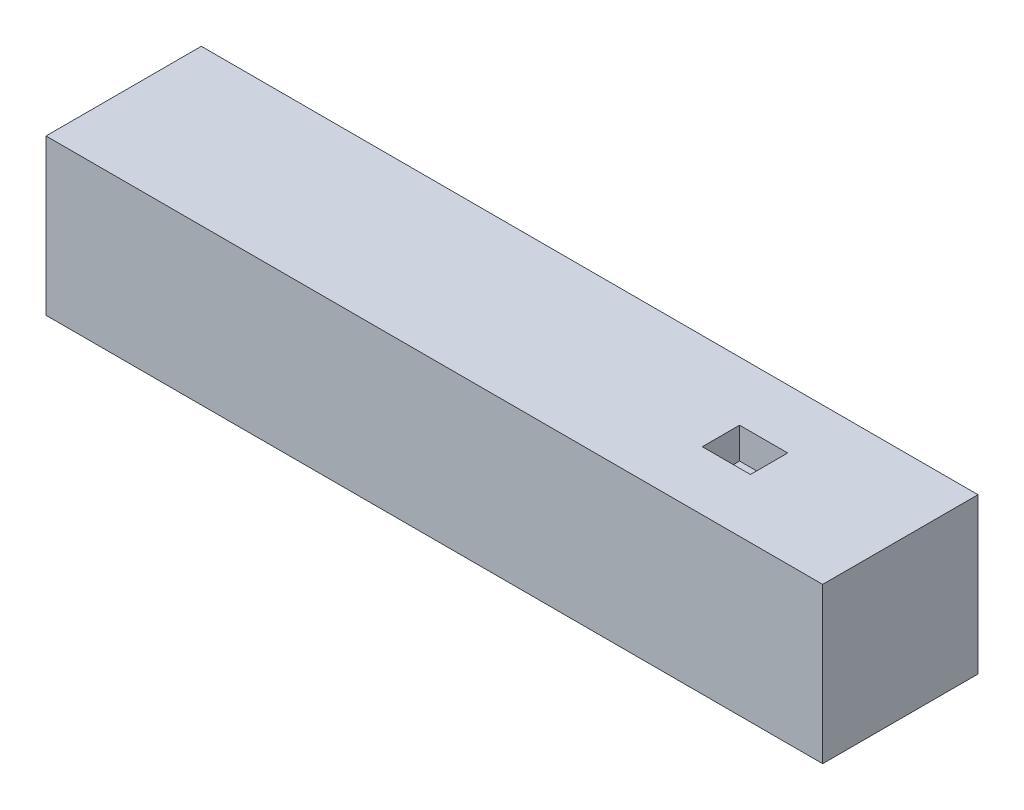
ISO-10303-21;
HEADER;
FILE_DESCRIPTION(('STEP AP214'),'2;1');
FILE_NAME('part.step','',(''),(''),'','','');
FILE_SCHEMA(('AUTOMOTIVE_DESIGN { 1 0 10303 214 1 1 1 1 }'));
ENDSEC;
DATA;
#1=APPLICATION_CONTEXT('core data for automotive mechanical design processes');
#2=APPLICATION_PROTOCOL_DEFINITION('international standard','automotive_design',2000,#1);
#3=PRODUCT_CONTEXT('',#1,'mechanical');
#4=PRODUCT('Part','Part','',(#3));
#5=PRODUCT_RELATED_PRODUCT_CATEGORY('part','',(#4));
#6=PRODUCT_DEFINITION_FORMATION('','',#4);
#7=PRODUCT_DEFINITION_CONTEXT('part definition',#1,'design');
#8=PRODUCT_DEFINITION('design','',#6,#7);
#9=PRODUCT_DEFINITION_SHAPE('','',#8);
#10=(LENGTH_UNIT() NAMED_UNIT(*) SI_UNIT(.MILLI.,.METRE.));
#11=(NAMED_UNIT(*) PLANE_ANGLE_UNIT() SI_UNIT($,.RADIAN.));
#12=(NAMED_UNIT(*) SI_UNIT($,.STERADIAN.) SOLID_ANGLE_UNIT());
#13=UNCERTAINTY_MEASURE_WITH_UNIT(LENGTH_MEASURE(1.E-05),#10,'distance_accuracy_value','');
#14=(GEOMETRIC_REPRESENTATION_CONTEXT(3) GLOBAL_UNCERTAINTY_ASSIGNED_CONTEXT((#13)) GLOBAL_UNIT_ASSIGNED_CONTEXT((#10,
#11,#12)) REPRESENTATION_CONTEXT('',''));
#15=CARTESIAN_POINT('',(0.,0.,0.));
#16=DIRECTION('',(0.,0.,1.));
#17=DIRECTION('',(1.,0.,0.));
#18=AXIS2_PLACEMENT_3D('',#15,#16,#17);
#19=CARTESIAN_POINT('',(25.,10.,5.));
#20=DIRECTION('',(-1.,0.,0.));
#21=DIRECTION('',(0.,0.,1.));
#22=AXIS2_PLACEMENT_3D('',#19,#20,#21);
#23=PLANE('',#22);
#24=DIRECTION('',(0.,0.,-1.));
#25=VECTOR('',#24,1.);
#26=CARTESIAN_POINT('',(25.,0.,5.));
#27=LINE('',#26,#25);
#28=CARTESIAN_POINT('',(25.,0.,5.));
#29=VERTEX_POINT('',#28);
#30=CARTESIAN_POINT('',(25.,0.,-5.));
#31=VERTEX_POINT('',#30);
#32=EDGE_CURVE('E141',#29,#31,#27,.T.);
#33=ORIENTED_EDGE('',*,*,#32,.T.);
#34=DIRECTION('',(0.,-1.,0.));
#35=VECTOR('',#34,1.);
#36=CARTESIAN_POINT('',(25.,10.,-5.));
#37=LINE('',#36,#35);
#38=CARTESIAN_POINT('',(25.,10.,-5.));
#39=VERTEX_POINT('',#38);
#40=EDGE_CURVE('E11',#39,#31,#37,.T.);
#41=ORIENTED_EDGE('',*,*,#40,.F.);
#42=DIRECTION('',(0.,0.,-1.));
#43=VECTOR('',#42,1.);
#44=CARTESIAN_POINT('',(25.,10.,5.));
#45=LINE('',#44,#43);
#46=CARTESIAN_POINT('',(25.,10.,5.));
#47=VERTEX_POINT('',#46);
#48=EDGE_CURVE('E145',#47,#39,#45,.T.);
#49=ORIENTED_EDGE('',*,*,#48,.F.);
#50=DIRECTION('',(0.,-1.,0.));
#51=VECTOR('',#50,1.);
#52=CARTESIAN_POINT('',(25.,10.,5.));
#53=LINE('',#52,#51);
#54=EDGE_CURVE('E151',#47,#29,#53,.T.);
#55=ORIENTED_EDGE('',*,*,#54,.T.);
#56=EDGE_LOOP('',(#33,#41,#49,#55));
#57=FACE_BOUND('',#56,.T.);
#58=ADVANCED_FACE('F33',(#57),#23,.F.);
#59=CARTESIAN_POINT('',(-25.,10.,-5.));
#60=DIRECTION('',(0.,0.,1.));
#61=DIRECTION('',(1.,0.,0.));
#62=AXIS2_PLACEMENT_3D('',#59,#60,#61);
#63=PLANE('',#62);
#64=DIRECTION('',(-1.,0.,0.));
#65=VECTOR('',#64,1.);
#66=CARTESIAN_POINT('',(-25.,0.,-5.));
#67=LINE('',#66,#65);
#68=CARTESIAN_POINT('',(-25.,0.,-5.));
#69=VERTEX_POINT('',#68);
#70=EDGE_CURVE('E154',#31,#69,#67,.T.);
#71=ORIENTED_EDGE('',*,*,#70,.T.);
#72=DIRECTION('',(0.,-1.,0.));
#73=VECTOR('',#72,1.);
#74=CARTESIAN_POINT('',(-25.,10.,-5.));
#75=LINE('',#74,#73);
#76=CARTESIAN_POINT('',(-25.,10.,-5.));
#77=VERTEX_POINT('',#76);
#78=EDGE_CURVE('E40',#77,#69,#75,.T.);
#79=ORIENTED_EDGE('',*,*,#78,.F.);
#80=DIRECTION('',(-1.,0.,0.));
#81=VECTOR('',#80,1.);
#82=CARTESIAN_POINT('',(-25.,10.,-5.));
#83=LINE('',#82,#81);
#84=EDGE_CURVE('E84',#39,#77,#83,.T.);
#85=ORIENTED_EDGE('',*,*,#84,.F.);
#86=ORIENTED_EDGE('',*,*,#40,.T.);
#87=EDGE_LOOP('',(#71,#79,#85,#86));
#88=FACE_BOUND('',#87,.T.);
#89=ADVANCED_FACE('F184',(#88),#63,.F.);
#90=CARTESIAN_POINT('',(-25.,10.,5.));
#91=DIRECTION('',(1.,0.,0.));
#92=DIRECTION('',(0.,0.,-1.));
#93=AXIS2_PLACEMENT_3D('',#90,#91,#92);
#94=PLANE('',#93);
#95=DIRECTION('',(0.,0.,1.));
#96=VECTOR('',#95,1.);
#97=CARTESIAN_POINT('',(-25.,0.,5.));
#98=LINE('',#97,#96);
#99=CARTESIAN_POINT('',(-25.,0.,5.));
#100=VERTEX_POINT('',#99);
#101=EDGE_CURVE('E156',#69,#100,#98,.T.);
#102=ORIENTED_EDGE('',*,*,#101,.T.);
#103=DIRECTION('',(0.,-1.,0.));
#104=VECTOR('',#103,1.);
#105=CARTESIAN_POINT('',(-25.,10.,5.));
#106=LINE('',#105,#104);
#107=CARTESIAN_POINT('',(-25.,10.,5.));
#108=VERTEX_POINT('',#107);
#109=EDGE_CURVE('E160',#108,#100,#106,.T.);
#110=ORIENTED_EDGE('',*,*,#109,.F.);
#111=DIRECTION('',(0.,0.,1.));
#112=VECTOR('',#111,1.);
#113=CARTESIAN_POINT('',(-25.,10.,5.));
#114=LINE('',#113,#112);
#115=EDGE_CURVE('E148',#77,#108,#114,.T.);
#116=ORIENTED_EDGE('',*,*,#115,.F.);
#117=ORIENTED_EDGE('',*,*,#78,.T.);
#118=EDGE_LOOP('',(#102,#110,#116,#117));
#119=FACE_BOUND('',#118,.T.);
#120=ADVANCED_FACE('F165',(#119),#94,.F.);
#121=CARTESIAN_POINT('',(-25.,10.,5.));
#122=DIRECTION('',(0.,0.,-1.));
#123=DIRECTION('',(-1.,0.,0.));
#124=AXIS2_PLACEMENT_3D('',#121,#122,#123);
#125=PLANE('',#124);
#126=DIRECTION('',(1.,0.,0.));
#127=VECTOR('',#126,1.);
#128=CARTESIAN_POINT('',(-25.,0.,5.));
#129=LINE('',#128,#127);
#130=EDGE_CURVE('E77',#100,#29,#129,.T.);
#131=ORIENTED_EDGE('',*,*,#130,.T.);
#132=ORIENTED_EDGE('',*,*,#54,.F.);
#133=DIRECTION('',(1.,0.,0.));
#134=VECTOR('',#133,1.);
#135=CARTESIAN_POINT('',(-25.,10.,5.));
#136=LINE('',#135,#134);
#137=EDGE_CURVE('E56',#108,#47,#136,.T.);
#138=ORIENTED_EDGE('',*,*,#137,.F.);
#139=ORIENTED_EDGE('',*,*,#109,.T.);
#140=EDGE_LOOP('',(#131,#132,#138,#139));
#141=FACE_BOUND('',#140,.T.);
#142=ADVANCED_FACE('F173',(#141),#125,.F.);
#143=CARTESIAN_POINT('',(0.,10.,0.));
#144=DIRECTION('',(0.,-1.,0.));
#145=DIRECTION('',(0.,0.,-1.));
#146=AXIS2_PLACEMENT_3D('',#143,#144,#145);
#147=PLANE('',#146);
#148=DIRECTION('',(-1.,0.,0.));
#149=VECTOR('',#148,1.);
#150=CARTESIAN_POINT('',(13.45,10.,-1.2));
#151=LINE('',#150,#149);
#152=CARTESIAN_POINT('',(16.55,10.,-1.2));
#153=VERTEX_POINT('',#152);
#154=CARTESIAN_POINT('',(13.45,10.,-1.2));
#155=VERTEX_POINT('',#154);
#156=EDGE_CURVE('E135',#153,#155,#151,.T.);
#157=ORIENTED_EDGE('',*,*,#156,.F.);
#158=DIRECTION('',(0.,0.,-1.));
#159=VECTOR('',#158,1.);
#160=CARTESIAN_POINT('',(16.55,10.,1.2));
#161=LINE('',#160,#159);
#162=CARTESIAN_POINT('',(16.55,10.,1.2));
#163=VERTEX_POINT('',#162);
#164=EDGE_CURVE('E47',#163,#153,#161,.T.);
#165=ORIENTED_EDGE('',*,*,#164,.F.);
#166=DIRECTION('',(1.,0.,0.));
#167=VECTOR('',#166,1.);
#168=CARTESIAN_POINT('',(13.45,10.,1.2));
#169=LINE('',#168,#167);
#170=CARTESIAN_POINT('',(13.45,10.,1.2));
#171=VERTEX_POINT('',#170);
#172=EDGE_CURVE('E126',#171,#163,#169,.T.);
#173=ORIENTED_EDGE('',*,*,#172,.F.);
#174=DIRECTION('',(0.,0.,1.));
#175=VECTOR('',#174,1.);
#176=CARTESIAN_POINT('',(13.45,10.,1.2));
#177=LINE('',#176,#175);
#178=EDGE_CURVE('E129',#155,#171,#177,.T.);
#179=ORIENTED_EDGE('',*,*,#178,.F.);
#180=EDGE_LOOP('',(#157,#165,#173,#179));
#181=FACE_BOUND('',#180,.T.);
#182=ORIENTED_EDGE('',*,*,#48,.T.);
#183=ORIENTED_EDGE('',*,*,#84,.T.);
#184=ORIENTED_EDGE('',*,*,#115,.T.);
#185=ORIENTED_EDGE('',*,*,#137,.T.);
#186=EDGE_LOOP('',(#182,#183,#184,#185));
#187=FACE_BOUND('',#186,.T.);
#188=ADVANCED_FACE('F175',(#181,#187),#147,.F.);
#189=CARTESIAN_POINT('',(0.,0.,0.));
#190=DIRECTION('',(0.,-1.,0.));
#191=DIRECTION('',(0.,0.,-1.));
#192=AXIS2_PLACEMENT_3D('',#189,#190,#191);
#193=PLANE('',#192);
#194=ORIENTED_EDGE('',*,*,#32,.F.);
#195=ORIENTED_EDGE('',*,*,#130,.F.);
#196=ORIENTED_EDGE('',*,*,#101,.F.);
#197=ORIENTED_EDGE('',*,*,#70,.F.);
#198=EDGE_LOOP('',(#194,#195,#196,#197));
#199=FACE_BOUND('',#198,.T.);
#200=ADVANCED_FACE('F169',(#199),#193,.T.);
#201=CARTESIAN_POINT('',(16.55,8.,1.2));
#202=DIRECTION('',(1.,0.,0.));
#203=DIRECTION('',(0.,0.,-1.));
#204=AXIS2_PLACEMENT_3D('',#201,#202,#203);
#205=PLANE('',#204);
#206=ORIENTED_EDGE('',*,*,#164,.T.);
#207=DIRECTION('',(0.,1.,0.));
#208=VECTOR('',#207,1.);
#209=CARTESIAN_POINT('',(16.55,8.,-1.2));
#210=LINE('',#209,#208);
#211=CARTESIAN_POINT('',(16.55,8.,-1.2));
#212=VERTEX_POINT('',#211);
#213=EDGE_CURVE('E104',#212,#153,#210,.T.);
#214=ORIENTED_EDGE('',*,*,#213,.F.);
#215=DIRECTION('',(0.,0.,-1.));
#216=VECTOR('',#215,1.);
#217=CARTESIAN_POINT('',(16.55,8.,1.2));
#218=LINE('',#217,#216);
#219=CARTESIAN_POINT('',(16.55,8.,1.2));
#220=VERTEX_POINT('',#219);
#221=EDGE_CURVE('E108',#220,#212,#218,.T.);
#222=ORIENTED_EDGE('',*,*,#221,.F.);
#223=DIRECTION('',(0.,1.,0.));
#224=VECTOR('',#223,1.);
#225=CARTESIAN_POINT('',(16.55,8.,1.2));
#226=LINE('',#225,#224);
#227=EDGE_CURVE('E139',#220,#163,#226,.T.);
#228=ORIENTED_EDGE('',*,*,#227,.T.);
#229=EDGE_LOOP('',(#206,#214,#222,#228));
#230=FACE_BOUND('',#229,.T.);
#231=ADVANCED_FACE('F106',(#230),#205,.F.);
#232=CARTESIAN_POINT('',(13.45,8.,1.2));
#233=DIRECTION('',(0.,0.,1.));
#234=DIRECTION('',(1.,0.,0.));
#235=AXIS2_PLACEMENT_3D('',#232,#233,#234);
#236=PLANE('',#235);
#237=ORIENTED_EDGE('',*,*,#172,.T.);
#238=ORIENTED_EDGE('',*,*,#227,.F.);
#239=DIRECTION('',(1.,0.,0.));
#240=VECTOR('',#239,1.);
#241=CARTESIAN_POINT('',(13.45,8.,1.2));
#242=LINE('',#241,#240);
#243=CARTESIAN_POINT('',(13.45,8.,1.2));
#244=VERTEX_POINT('',#243);
#245=EDGE_CURVE('E114',#244,#220,#242,.T.);
#246=ORIENTED_EDGE('',*,*,#245,.F.);
#247=DIRECTION('',(0.,1.,0.));
#248=VECTOR('',#247,1.);
#249=CARTESIAN_POINT('',(13.45,8.,1.2));
#250=LINE('',#249,#248);
#251=EDGE_CURVE('E142',#244,#171,#250,.T.);
#252=ORIENTED_EDGE('',*,*,#251,.T.);
#253=EDGE_LOOP('',(#237,#238,#246,#252));
#254=FACE_BOUND('',#253,.T.);
#255=ADVANCED_FACE('F220',(#254),#236,.F.);
#256=CARTESIAN_POINT('',(13.45,8.,1.2));
#257=DIRECTION('',(-1.,0.,0.));
#258=DIRECTION('',(0.,0.,1.));
#259=AXIS2_PLACEMENT_3D('',#256,#257,#258);
#260=PLANE('',#259);
#261=ORIENTED_EDGE('',*,*,#178,.T.);
#262=ORIENTED_EDGE('',*,*,#251,.F.);
#263=DIRECTION('',(0.,0.,1.));
#264=VECTOR('',#263,1.);
#265=CARTESIAN_POINT('',(13.45,8.,1.2));
#266=LINE('',#265,#264);
#267=CARTESIAN_POINT('',(13.45,8.,-1.2));
#268=VERTEX_POINT('',#267);
#269=EDGE_CURVE('E122',#268,#244,#266,.T.);
#270=ORIENTED_EDGE('',*,*,#269,.F.);
#271=DIRECTION('',(0.,1.,0.));
#272=VECTOR('',#271,1.);
#273=CARTESIAN_POINT('',(13.45,8.,-1.2));
#274=LINE('',#273,#272);
#275=EDGE_CURVE('E113',#268,#155,#274,.T.);
#276=ORIENTED_EDGE('',*,*,#275,.T.);
#277=EDGE_LOOP('',(#261,#262,#270,#276));
#278=FACE_BOUND('',#277,.T.);
#279=ADVANCED_FACE('F229',(#278),#260,.F.);
#280=CARTESIAN_POINT('',(13.45,8.,-1.2));
#281=DIRECTION('',(0.,0.,-1.));
#282=DIRECTION('',(-1.,0.,0.));
#283=AXIS2_PLACEMENT_3D('',#280,#281,#282);
#284=PLANE('',#283);
#285=ORIENTED_EDGE('',*,*,#156,.T.);
#286=ORIENTED_EDGE('',*,*,#275,.F.);
#287=DIRECTION('',(-1.,0.,0.));
#288=VECTOR('',#287,1.);
#289=CARTESIAN_POINT('',(13.45,8.,-1.2));
#290=LINE('',#289,#288);
#291=EDGE_CURVE('E117',#212,#268,#290,.T.);
#292=ORIENTED_EDGE('',*,*,#291,.F.);
#293=ORIENTED_EDGE('',*,*,#213,.T.);
#294=EDGE_LOOP('',(#285,#286,#292,#293));
#295=FACE_BOUND('',#294,.T.);
#296=ADVANCED_FACE('F118',(#295),#284,.F.);
#297=CARTESIAN_POINT('',(0.,8.,0.));
#298=DIRECTION('',(0.,-1.,0.));
#299=DIRECTION('',(0.,0.,-1.));
#300=AXIS2_PLACEMENT_3D('',#297,#298,#299);
#301=PLANE('',#300);
#302=ORIENTED_EDGE('',*,*,#221,.T.);
#303=ORIENTED_EDGE('',*,*,#291,.T.);
#304=ORIENTED_EDGE('',*,*,#269,.T.);
#305=ORIENTED_EDGE('',*,*,#245,.T.);
#306=EDGE_LOOP('',(#302,#303,#304,#305));
#307=FACE_BOUND('',#306,.T.);
#308=ADVANCED_FACE('F124',(#307),#301,.F.);
#309=CLOSED_SHELL('',(#58,#89,#120,#142,#188,#200,#231,#255,#279,#296,#308));
#310=MANIFOLD_SOLID_BREP('B2',#309);
#311=ADVANCED_BREP_SHAPE_REPRESENTATION('',(#18,#310),#14);
#312=SHAPE_DEFINITION_REPRESENTATION(#9,#311);
ENDSEC;
END-ISO-10303-21;
